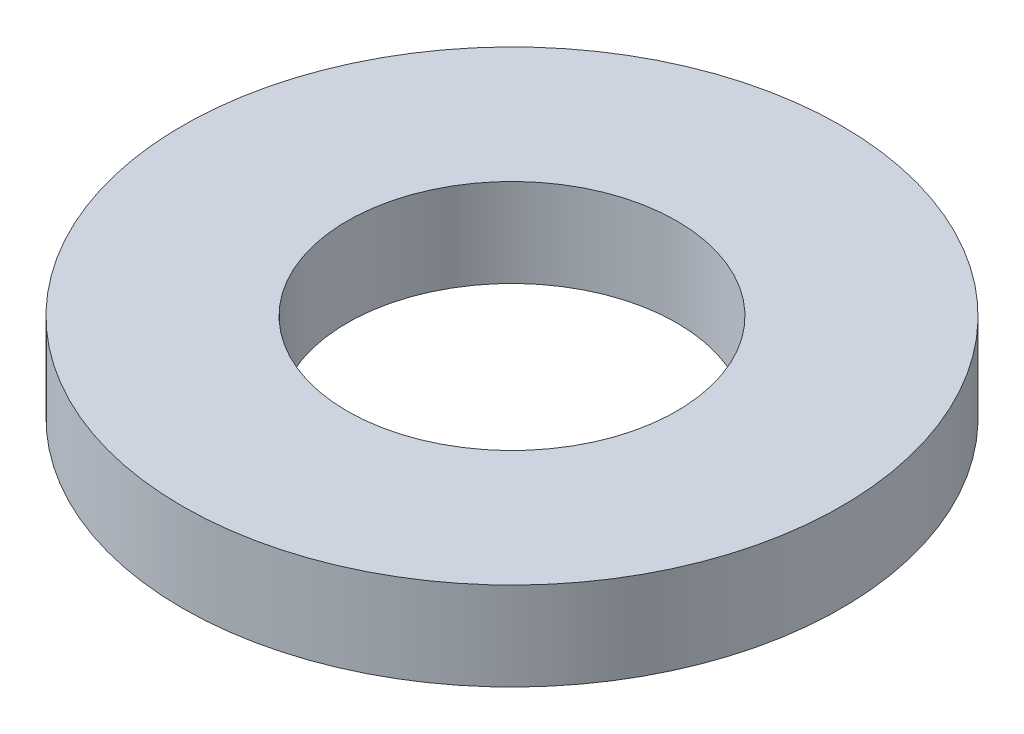
ISO-10303-21;
HEADER;
FILE_DESCRIPTION(('STEP AP214'),'2;1');
FILE_NAME('part.step','',(''),(''),'','','');
FILE_SCHEMA(('AUTOMOTIVE_DESIGN { 1 0 10303 214 1 1 1 1 }'));
ENDSEC;
DATA;
#1=APPLICATION_CONTEXT('core data for automotive mechanical design processes');
#2=APPLICATION_PROTOCOL_DEFINITION('international standard','automotive_design',2000,#1);
#3=PRODUCT_CONTEXT('',#1,'mechanical');
#4=PRODUCT('Part','Part','',(#3));
#5=PRODUCT_RELATED_PRODUCT_CATEGORY('part','',(#4));
#6=PRODUCT_DEFINITION_FORMATION('','',#4);
#7=PRODUCT_DEFINITION_CONTEXT('part definition',#1,'design');
#8=PRODUCT_DEFINITION('design','',#6,#7);
#9=PRODUCT_DEFINITION_SHAPE('','',#8);
#10=(LENGTH_UNIT() NAMED_UNIT(*) SI_UNIT(.MILLI.,.METRE.));
#11=(NAMED_UNIT(*) PLANE_ANGLE_UNIT() SI_UNIT($,.RADIAN.));
#12=(NAMED_UNIT(*) SI_UNIT($,.STERADIAN.) SOLID_ANGLE_UNIT());
#13=UNCERTAINTY_MEASURE_WITH_UNIT(LENGTH_MEASURE(1.E-05),#10,'distance_accuracy_value','');
#14=(GEOMETRIC_REPRESENTATION_CONTEXT(3) GLOBAL_UNCERTAINTY_ASSIGNED_CONTEXT((#13)) GLOBAL_UNIT_ASSIGNED_CONTEXT((#10,
#11,#12)) REPRESENTATION_CONTEXT('',''));
#15=CARTESIAN_POINT('',(0.,0.,0.));
#16=DIRECTION('',(0.,0.,1.));
#17=DIRECTION('',(1.,0.,0.));
#18=AXIS2_PLACEMENT_3D('',#15,#16,#17);
#19=CARTESIAN_POINT('',(0.,1.7018,0.));
#20=DIRECTION('',(0.,-1.,0.));
#21=DIRECTION('',(0.,0.,-1.));
#22=AXIS2_PLACEMENT_3D('',#19,#20,#21);
#23=CYLINDRICAL_SURFACE('',#22,6.35);
#24=CARTESIAN_POINT('',(0.,1.7018,0.));
#25=DIRECTION('',(0.,1.,0.));
#26=DIRECTION('',(0.,0.,1.));
#27=AXIS2_PLACEMENT_3D('',#24,#25,#26);
#28=CIRCLE('',#27,6.35);
#29=CARTESIAN_POINT('',(0.,1.7018,6.35));
#30=VERTEX_POINT('',#29);
#31=EDGE_CURVE('E10',#30,#30,#28,.T.);
#32=ORIENTED_EDGE('',*,*,#31,.F.);
#33=EDGE_LOOP('',(#32));
#34=FACE_BOUND('',#33,.T.);
#35=CARTESIAN_POINT('',(0.,0.,0.));
#36=DIRECTION('',(0.,1.,0.));
#37=DIRECTION('',(0.,0.,1.));
#38=AXIS2_PLACEMENT_3D('',#35,#36,#37);
#39=CIRCLE('',#38,6.35);
#40=CARTESIAN_POINT('',(0.,0.,6.35));
#41=VERTEX_POINT('',#40);
#42=EDGE_CURVE('E33',#41,#41,#39,.T.);
#43=ORIENTED_EDGE('',*,*,#42,.T.);
#44=EDGE_LOOP('',(#43));
#45=FACE_BOUND('',#44,.T.);
#46=ADVANCED_FACE('F30',(#34,#45),#23,.T.);
#47=CARTESIAN_POINT('',(0.,1.7018,0.));
#48=DIRECTION('',(0.,1.,0.));
#49=DIRECTION('',(0.,0.,1.));
#50=AXIS2_PLACEMENT_3D('',#47,#48,#49);
#51=PLANE('',#50);
#52=CARTESIAN_POINT('',(0.,1.7018,0.));
#53=DIRECTION('',(0.,1.,0.));
#54=DIRECTION('',(0.,0.,1.));
#55=AXIS2_PLACEMENT_3D('',#52,#53,#54);
#56=CIRCLE('',#55,3.175);
#57=CARTESIAN_POINT('',(0.,1.7018,3.175));
#58=VERTEX_POINT('',#57);
#59=EDGE_CURVE('E42',#58,#58,#56,.T.);
#60=ORIENTED_EDGE('',*,*,#59,.F.);
#61=EDGE_LOOP('',(#60));
#62=FACE_BOUND('',#61,.T.);
#63=ORIENTED_EDGE('',*,*,#31,.T.);
#64=EDGE_LOOP('',(#63));
#65=FACE_BOUND('',#64,.T.);
#66=ADVANCED_FACE('F57',(#62,#65),#51,.T.);
#67=CARTESIAN_POINT('',(0.,0.,0.));
#68=DIRECTION('',(0.,1.,0.));
#69=DIRECTION('',(0.,0.,1.));
#70=AXIS2_PLACEMENT_3D('',#67,#68,#69);
#71=PLANE('',#70);
#72=CARTESIAN_POINT('',(0.,0.,0.));
#73=DIRECTION('',(0.,1.,0.));
#74=DIRECTION('',(0.,0.,1.));
#75=AXIS2_PLACEMENT_3D('',#72,#73,#74);
#76=CIRCLE('',#75,3.175);
#77=CARTESIAN_POINT('',(0.,0.,3.175));
#78=VERTEX_POINT('',#77);
#79=EDGE_CURVE('E40',#78,#78,#76,.T.);
#80=ORIENTED_EDGE('',*,*,#79,.T.);
#81=EDGE_LOOP('',(#80));
#82=FACE_BOUND('',#81,.T.);
#83=ORIENTED_EDGE('',*,*,#42,.F.);
#84=EDGE_LOOP('',(#83));
#85=FACE_BOUND('',#84,.T.);
#86=ADVANCED_FACE('F48',(#82,#85),#71,.F.);
#87=CARTESIAN_POINT('',(0.,0.,0.));
#88=DIRECTION('',(0.,1.,0.));
#89=DIRECTION('',(0.,0.,1.));
#90=AXIS2_PLACEMENT_3D('',#87,#88,#89);
#91=CYLINDRICAL_SURFACE('',#90,3.175);
#92=ORIENTED_EDGE('',*,*,#79,.F.);
#93=EDGE_LOOP('',(#92));
#94=FACE_BOUND('',#93,.T.);
#95=ORIENTED_EDGE('',*,*,#59,.T.);
#96=EDGE_LOOP('',(#95));
#97=FACE_BOUND('',#96,.T.);
#98=ADVANCED_FACE('F51',(#94,#97),#91,.F.);
#99=CLOSED_SHELL('',(#46,#66,#86,#98));
#100=MANIFOLD_SOLID_BREP('B2',#99);
#101=ADVANCED_BREP_SHAPE_REPRESENTATION('',(#18,#100),#14);
#102=SHAPE_DEFINITION_REPRESENTATION(#9,#101);
ENDSEC;
END-ISO-10303-21;
